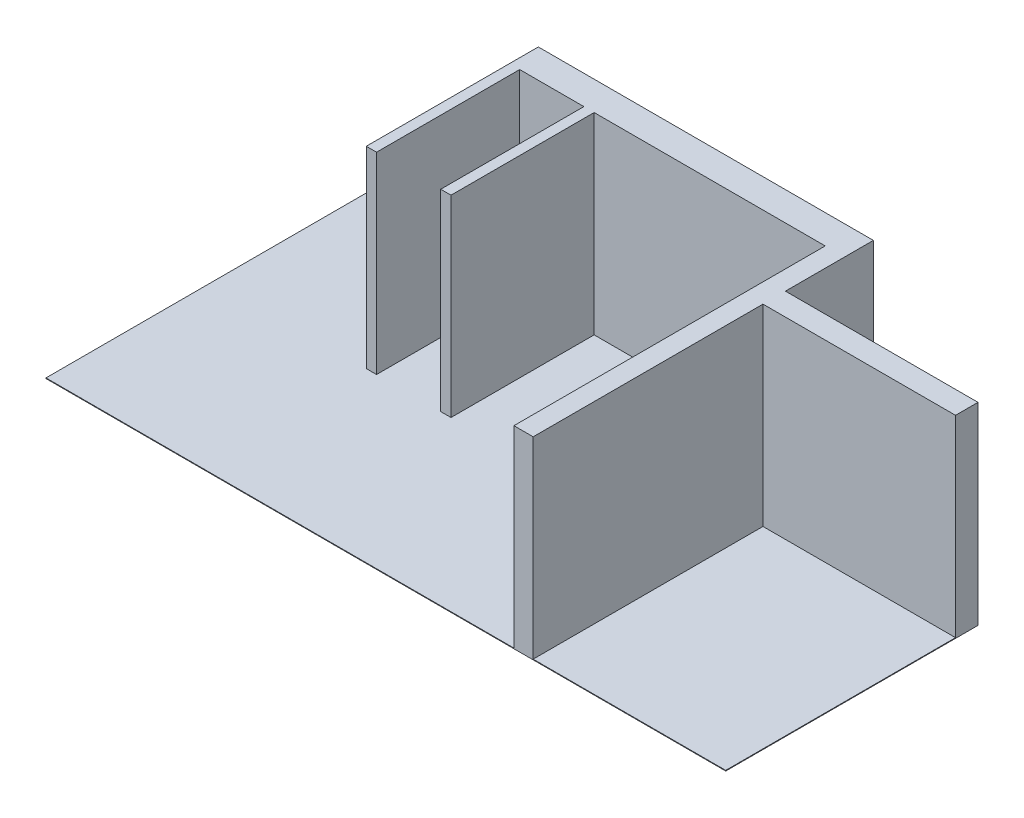
ISO-10303-21;
HEADER;
FILE_DESCRIPTION(('STEP AP214'),'2;1');
FILE_NAME('part.step','',(''),(''),'','','');
FILE_SCHEMA(('AUTOMOTIVE_DESIGN { 1 0 10303 214 1 1 1 1 }'));
ENDSEC;
DATA;
#1=APPLICATION_CONTEXT('core data for automotive mechanical design processes');
#2=APPLICATION_PROTOCOL_DEFINITION('international standard','automotive_design',2000,#1);
#3=PRODUCT_CONTEXT('',#1,'mechanical');
#4=PRODUCT('Part','Part','',(#3));
#5=PRODUCT_RELATED_PRODUCT_CATEGORY('part','',(#4));
#6=PRODUCT_DEFINITION_FORMATION('','',#4);
#7=PRODUCT_DEFINITION_CONTEXT('part definition',#1,'design');
#8=PRODUCT_DEFINITION('design','',#6,#7);
#9=PRODUCT_DEFINITION_SHAPE('','',#8);
#10=(LENGTH_UNIT() NAMED_UNIT(*) SI_UNIT(.MILLI.,.METRE.));
#11=(NAMED_UNIT(*) PLANE_ANGLE_UNIT() SI_UNIT($,.RADIAN.));
#12=(NAMED_UNIT(*) SI_UNIT($,.STERADIAN.) SOLID_ANGLE_UNIT());
#13=UNCERTAINTY_MEASURE_WITH_UNIT(LENGTH_MEASURE(1.E-05),#10,'distance_accuracy_value','');
#14=(GEOMETRIC_REPRESENTATION_CONTEXT(3) GLOBAL_UNCERTAINTY_ASSIGNED_CONTEXT((#13)) GLOBAL_UNIT_ASSIGNED_CONTEXT((#10,
#11,#12)) REPRESENTATION_CONTEXT('',''));
#15=CARTESIAN_POINT('',(0.,0.,0.));
#16=DIRECTION('',(0.,0.,1.));
#17=DIRECTION('',(1.,0.,0.));
#18=AXIS2_PLACEMENT_3D('',#15,#16,#17);
#19=CARTESIAN_POINT('',(-1800.,3000.,2230.));
#20=DIRECTION('',(-1.,0.,0.));
#21=DIRECTION('',(0.,0.,1.));
#22=AXIS2_PLACEMENT_3D('',#19,#20,#21);
#23=PLANE('',#22);
#24=DIRECTION('',(0.,0.,-1.));
#25=VECTOR('',#24,1.);
#26=CARTESIAN_POINT('',(-1800.,0.,2230.));
#27=LINE('',#26,#25);
#28=CARTESIAN_POINT('',(-1800.,0.,2230.));
#29=VERTEX_POINT('',#28);
#30=CARTESIAN_POINT('',(-1800.,0.,0.));
#31=VERTEX_POINT('',#30);
#32=EDGE_CURVE('E166',#29,#31,#27,.T.);
#33=ORIENTED_EDGE('',*,*,#32,.T.);
#34=DIRECTION('',(0.,-1.,0.));
#35=VECTOR('',#34,1.);
#36=CARTESIAN_POINT('',(-1800.,3000.,0.));
#37=LINE('',#36,#35);
#38=CARTESIAN_POINT('',(-1800.,3000.,0.));
#39=VERTEX_POINT('',#38);
#40=EDGE_CURVE('E11',#39,#31,#37,.T.);
#41=ORIENTED_EDGE('',*,*,#40,.F.);
#42=DIRECTION('',(0.,0.,-1.));
#43=VECTOR('',#42,1.);
#44=CARTESIAN_POINT('',(-1800.,3000.,2230.));
#45=LINE('',#44,#43);
#46=CARTESIAN_POINT('',(-1800.,3000.,2230.));
#47=VERTEX_POINT('',#46);
#48=EDGE_CURVE('E189',#47,#39,#45,.T.);
#49=ORIENTED_EDGE('',*,*,#48,.F.);
#50=DIRECTION('',(0.,-1.,0.));
#51=VECTOR('',#50,1.);
#52=CARTESIAN_POINT('',(-1800.,3000.,2230.));
#53=LINE('',#52,#51);
#54=EDGE_CURVE('E162',#47,#29,#53,.T.);
#55=ORIENTED_EDGE('',*,*,#54,.T.);
#56=EDGE_LOOP('',(#33,#41,#49,#55));
#57=FACE_BOUND('',#56,.T.);
#58=ADVANCED_FACE('F37',(#57),#23,.F.);
#59=CARTESIAN_POINT('',(-1800.,3000.,0.));
#60=DIRECTION('',(0.,0.,-1.));
#61=DIRECTION('',(-1.,0.,0.));
#62=AXIS2_PLACEMENT_3D('',#59,#60,#61);
#63=PLANE('',#62);
#64=DIRECTION('',(1.,0.,0.));
#65=VECTOR('',#64,1.);
#66=CARTESIAN_POINT('',(-1800.,0.,0.));
#67=LINE('',#66,#65);
#68=CARTESIAN_POINT('',(1800.,0.,-6.61309271539571E-13));
#69=VERTEX_POINT('',#68);
#70=EDGE_CURVE('E169',#31,#69,#67,.T.);
#71=ORIENTED_EDGE('',*,*,#70,.T.);
#72=DIRECTION('',(0.,-1.,0.));
#73=VECTOR('',#72,1.);
#74=CARTESIAN_POINT('',(1800.,3000.,-6.61309271539571E-13));
#75=LINE('',#74,#73);
#76=CARTESIAN_POINT('',(1800.,3000.,-6.61309271539571E-13));
#77=VERTEX_POINT('',#76);
#78=EDGE_CURVE('E45',#77,#69,#75,.T.);
#79=ORIENTED_EDGE('',*,*,#78,.F.);
#80=DIRECTION('',(1.,0.,0.));
#81=VECTOR('',#80,1.);
#82=CARTESIAN_POINT('',(-1800.,3000.,0.));
#83=LINE('',#82,#81);
#84=EDGE_CURVE('E102',#39,#77,#83,.T.);
#85=ORIENTED_EDGE('',*,*,#84,.F.);
#86=ORIENTED_EDGE('',*,*,#40,.T.);
#87=EDGE_LOOP('',(#71,#79,#85,#86));
#88=FACE_BOUND('',#87,.T.);
#89=ADVANCED_FACE('F306',(#88),#63,.F.);
#90=CARTESIAN_POINT('',(1800.,3000.,-6.61309271539571E-13));
#91=DIRECTION('',(1.,0.,0.));
#92=DIRECTION('',(0.,0.,-1.));
#93=AXIS2_PLACEMENT_3D('',#90,#91,#92);
#94=PLANE('',#93);
#95=DIRECTION('',(0.,0.,1.));
#96=VECTOR('',#95,1.);
#97=CARTESIAN_POINT('',(1800.,0.,-6.61309271539571E-13));
#98=LINE('',#97,#96);
#99=CARTESIAN_POINT('',(1800.,0.,4850.));
#100=VERTEX_POINT('',#99);
#101=EDGE_CURVE('E172',#69,#100,#98,.T.);
#102=ORIENTED_EDGE('',*,*,#101,.T.);
#103=DIRECTION('',(0.,-1.,0.));
#104=VECTOR('',#103,1.);
#105=CARTESIAN_POINT('',(1800.,3000.,4850.));
#106=LINE('',#105,#104);
#107=CARTESIAN_POINT('',(1800.,3000.,4850.));
#108=VERTEX_POINT('',#107);
#109=EDGE_CURVE('E219',#108,#100,#106,.T.);
#110=ORIENTED_EDGE('',*,*,#109,.F.);
#111=DIRECTION('',(0.,0.,1.));
#112=VECTOR('',#111,1.);
#113=CARTESIAN_POINT('',(1800.,3000.,-6.61309271539571E-13));
#114=LINE('',#113,#112);
#115=EDGE_CURVE('E227',#77,#108,#114,.T.);
#116=ORIENTED_EDGE('',*,*,#115,.F.);
#117=ORIENTED_EDGE('',*,*,#78,.T.);
#118=EDGE_LOOP('',(#102,#110,#116,#117));
#119=FACE_BOUND('',#118,.T.);
#120=ADVANCED_FACE('F225',(#119),#94,.F.);
#121=CARTESIAN_POINT('',(1800.,3000.,4850.));
#122=DIRECTION('',(0.,0.,-1.));
#123=DIRECTION('',(-1.,0.,0.));
#124=AXIS2_PLACEMENT_3D('',#121,#122,#123);
#125=PLANE('',#124);
#126=DIRECTION('',(-1.,0.,0.));
#127=VECTOR('',#126,1.);
#128=CARTESIAN_POINT('',(5100.,0.,4850.));
#129=LINE('',#128,#127);
#130=CARTESIAN_POINT('',(5100.,0.,4850.));
#131=VERTEX_POINT('',#130);
#132=CARTESIAN_POINT('',(2100.,0.,4850.));
#133=VERTEX_POINT('',#132);
#134=EDGE_CURVE('E473',#131,#133,#129,.T.);
#135=ORIENTED_EDGE('',*,*,#134,.T.);
#136=DIRECTION('',(0.,-1.,0.));
#137=VECTOR('',#136,1.);
#138=CARTESIAN_POINT('',(2100.,3000.,4850.));
#139=LINE('',#138,#137);
#140=CARTESIAN_POINT('',(2100.,3000.,4850.));
#141=VERTEX_POINT('',#140);
#142=EDGE_CURVE('E216',#141,#133,#139,.T.);
#143=ORIENTED_EDGE('',*,*,#142,.F.);
#144=DIRECTION('',(1.,0.,0.));
#145=VECTOR('',#144,1.);
#146=CARTESIAN_POINT('',(1800.,3000.,4850.));
#147=LINE('',#146,#145);
#148=EDGE_CURVE('E265',#108,#141,#147,.T.);
#149=ORIENTED_EDGE('',*,*,#148,.F.);
#150=ORIENTED_EDGE('',*,*,#109,.T.);
#151=DIRECTION('',(-1.,0.,0.));
#152=VECTOR('',#151,1.);
#153=CARTESIAN_POINT('',(1800.,0.,4850.));
#154=LINE('',#153,#152);
#155=CARTESIAN_POINT('',(-5489.74863964533,0.,4850.));
#156=VERTEX_POINT('',#155);
#157=EDGE_CURVE('E236',#100,#156,#154,.T.);
#158=ORIENTED_EDGE('',*,*,#157,.T.);
#159=DIRECTION('',(0.,1.,0.));
#160=VECTOR('',#159,1.);
#161=CARTESIAN_POINT('',(-5489.74863964533,-10.,4850.));
#162=LINE('',#161,#160);
#163=CARTESIAN_POINT('',(-5489.74863964533,-10.,4850.));
#164=VERTEX_POINT('',#163);
#165=EDGE_CURVE('E170',#164,#156,#162,.T.);
#166=ORIENTED_EDGE('',*,*,#165,.F.);
#167=DIRECTION('',(-1.,0.,0.));
#168=VECTOR('',#167,1.);
#169=CARTESIAN_POINT('',(1800.,-10.,4850.));
#170=LINE('',#169,#168);
#171=CARTESIAN_POINT('',(5100.,-10.,4850.));
#172=VERTEX_POINT('',#171);
#173=EDGE_CURVE('E488',#172,#164,#170,.T.);
#174=ORIENTED_EDGE('',*,*,#173,.F.);
#175=DIRECTION('',(0.,1.,0.));
#176=VECTOR('',#175,1.);
#177=CARTESIAN_POINT('',(5100.,-10.,4850.));
#178=LINE('',#177,#176);
#179=EDGE_CURVE('E244',#172,#131,#178,.T.);
#180=ORIENTED_EDGE('',*,*,#179,.T.);
#181=EDGE_LOOP('',(#135,#143,#149,#150,#158,#166,#174,#180));
#182=FACE_BOUND('',#181,.T.);
#183=ADVANCED_FACE('F313',(#182),#125,.F.);
#184=CARTESIAN_POINT('',(2100.,3000.,4850.));
#185=DIRECTION('',(-1.,0.,0.));
#186=DIRECTION('',(0.,0.,1.));
#187=AXIS2_PLACEMENT_3D('',#184,#185,#186);
#188=PLANE('',#187);
#189=DIRECTION('',(0.,0.,-1.));
#190=VECTOR('',#189,1.);
#191=CARTESIAN_POINT('',(2100.,0.,4850.));
#192=LINE('',#191,#190);
#193=CARTESIAN_POINT('',(2100.,0.,1270.));
#194=VERTEX_POINT('',#193);
#195=EDGE_CURVE('E174',#133,#194,#192,.T.);
#196=ORIENTED_EDGE('',*,*,#195,.T.);
#197=DIRECTION('',(0.,-1.,0.));
#198=VECTOR('',#197,1.);
#199=CARTESIAN_POINT('',(2100.,3000.,1270.));
#200=LINE('',#199,#198);
#201=CARTESIAN_POINT('',(2100.,3000.,1270.));
#202=VERTEX_POINT('',#201);
#203=EDGE_CURVE('E213',#202,#194,#200,.T.);
#204=ORIENTED_EDGE('',*,*,#203,.F.);
#205=DIRECTION('',(0.,0.,-1.));
#206=VECTOR('',#205,1.);
#207=CARTESIAN_POINT('',(2100.,3000.,4850.));
#208=LINE('',#207,#206);
#209=EDGE_CURVE('E267',#141,#202,#208,.T.);
#210=ORIENTED_EDGE('',*,*,#209,.F.);
#211=ORIENTED_EDGE('',*,*,#142,.T.);
#212=EDGE_LOOP('',(#196,#204,#210,#211));
#213=FACE_BOUND('',#212,.T.);
#214=ADVANCED_FACE('F318',(#213),#188,.F.);
#215=CARTESIAN_POINT('',(2100.,3000.,1270.));
#216=DIRECTION('',(0.,0.,-1.));
#217=DIRECTION('',(-1.,0.,0.));
#218=AXIS2_PLACEMENT_3D('',#215,#216,#217);
#219=PLANE('',#218);
#220=DIRECTION('',(1.,0.,0.));
#221=VECTOR('',#220,1.);
#222=CARTESIAN_POINT('',(2100.,0.,1270.));
#223=LINE('',#222,#221);
#224=CARTESIAN_POINT('',(5100.,0.,1270.));
#225=VERTEX_POINT('',#224);
#226=EDGE_CURVE('E177',#194,#225,#223,.T.);
#227=ORIENTED_EDGE('',*,*,#226,.T.);
#228=DIRECTION('',(0.,-1.,0.));
#229=VECTOR('',#228,1.);
#230=CARTESIAN_POINT('',(5100.,3000.,1270.));
#231=LINE('',#230,#229);
#232=CARTESIAN_POINT('',(5100.,3000.,1270.));
#233=VERTEX_POINT('',#232);
#234=EDGE_CURVE('E210',#233,#225,#231,.T.);
#235=ORIENTED_EDGE('',*,*,#234,.F.);
#236=DIRECTION('',(1.,0.,0.));
#237=VECTOR('',#236,1.);
#238=CARTESIAN_POINT('',(2100.,3000.,1270.));
#239=LINE('',#238,#237);
#240=EDGE_CURVE('E269',#202,#233,#239,.T.);
#241=ORIENTED_EDGE('',*,*,#240,.F.);
#242=ORIENTED_EDGE('',*,*,#203,.T.);
#243=EDGE_LOOP('',(#227,#235,#241,#242));
#244=FACE_BOUND('',#243,.T.);
#245=ADVANCED_FACE('F321',(#244),#219,.F.);
#246=CARTESIAN_POINT('',(5100.,3000.,1270.));
#247=DIRECTION('',(-1.,0.,0.));
#248=DIRECTION('',(0.,0.,1.));
#249=AXIS2_PLACEMENT_3D('',#246,#247,#248);
#250=PLANE('',#249);
#251=ORIENTED_EDGE('',*,*,#234,.T.);
#252=DIRECTION('',(0.,0.,1.));
#253=VECTOR('',#252,1.);
#254=CARTESIAN_POINT('',(5100.,0.,920.));
#255=LINE('',#254,#253);
#256=EDGE_CURVE('E463',#225,#131,#255,.T.);
#257=ORIENTED_EDGE('',*,*,#256,.T.);
#258=ORIENTED_EDGE('',*,*,#179,.F.);
#259=DIRECTION('',(0.,0.,1.));
#260=VECTOR('',#259,1.);
#261=CARTESIAN_POINT('',(5100.,-10.,920.));
#262=LINE('',#261,#260);
#263=CARTESIAN_POINT('',(5100.,-10.,920.));
#264=VERTEX_POINT('',#263);
#265=EDGE_CURVE('E249',#264,#172,#262,.T.);
#266=ORIENTED_EDGE('',*,*,#265,.F.);
#267=DIRECTION('',(0.,-1.,0.));
#268=VECTOR('',#267,1.);
#269=CARTESIAN_POINT('',(5100.,3000.,920.));
#270=LINE('',#269,#268);
#271=CARTESIAN_POINT('',(5100.,3000.,920.));
#272=VERTEX_POINT('',#271);
#273=EDGE_CURVE('E207',#272,#264,#270,.T.);
#274=ORIENTED_EDGE('',*,*,#273,.F.);
#275=DIRECTION('',(0.,0.,-1.));
#276=VECTOR('',#275,1.);
#277=CARTESIAN_POINT('',(5100.,3000.,1270.));
#278=LINE('',#277,#276);
#279=EDGE_CURVE('E271',#233,#272,#278,.T.);
#280=ORIENTED_EDGE('',*,*,#279,.F.);
#281=EDGE_LOOP('',(#251,#257,#258,#266,#274,#280));
#282=FACE_BOUND('',#281,.T.);
#283=ADVANCED_FACE('F325',(#282),#250,.F.);
#284=CARTESIAN_POINT('',(5100.,3000.,920.));
#285=DIRECTION('',(0.,0.,1.));
#286=DIRECTION('',(1.,0.,0.));
#287=AXIS2_PLACEMENT_3D('',#284,#285,#286);
#288=PLANE('',#287);
#289=ORIENTED_EDGE('',*,*,#273,.T.);
#290=DIRECTION('',(1.,0.,0.));
#291=VECTOR('',#290,1.);
#292=CARTESIAN_POINT('',(2100.,-10.,920.));
#293=LINE('',#292,#291);
#294=CARTESIAN_POINT('',(2100.,-10.,920.));
#295=VERTEX_POINT('',#294);
#296=EDGE_CURVE('E482',#295,#264,#293,.T.);
#297=ORIENTED_EDGE('',*,*,#296,.F.);
#298=DIRECTION('',(0.,-1.,0.));
#299=VECTOR('',#298,1.);
#300=CARTESIAN_POINT('',(2100.,3000.,920.));
#301=LINE('',#300,#299);
#302=CARTESIAN_POINT('',(2100.,3000.,920.));
#303=VERTEX_POINT('',#302);
#304=EDGE_CURVE('E204',#303,#295,#301,.T.);
#305=ORIENTED_EDGE('',*,*,#304,.F.);
#306=DIRECTION('',(-1.,0.,0.));
#307=VECTOR('',#306,1.);
#308=CARTESIAN_POINT('',(5100.,3000.,920.));
#309=LINE('',#308,#307);
#310=EDGE_CURVE('E273',#272,#303,#309,.T.);
#311=ORIENTED_EDGE('',*,*,#310,.F.);
#312=EDGE_LOOP('',(#289,#297,#305,#311));
#313=FACE_BOUND('',#312,.T.);
#314=ADVANCED_FACE('F329',(#313),#288,.F.);
#315=CARTESIAN_POINT('',(2100.,3000.,920.));
#316=DIRECTION('',(-1.,0.,0.));
#317=DIRECTION('',(0.,0.,1.));
#318=AXIS2_PLACEMENT_3D('',#315,#316,#317);
#319=PLANE('',#318);
#320=ORIENTED_EDGE('',*,*,#304,.T.);
#321=DIRECTION('',(0.,0.,1.));
#322=VECTOR('',#321,1.);
#323=CARTESIAN_POINT('',(2100.,-10.,-450.));
#324=LINE('',#323,#322);
#325=CARTESIAN_POINT('',(2100.,-10.,-450.));
#326=VERTEX_POINT('',#325);
#327=EDGE_CURVE('E479',#326,#295,#324,.T.);
#328=ORIENTED_EDGE('',*,*,#327,.F.);
#329=DIRECTION('',(0.,-1.,0.));
#330=VECTOR('',#329,1.);
#331=CARTESIAN_POINT('',(2100.,3000.,-450.));
#332=LINE('',#331,#330);
#333=CARTESIAN_POINT('',(2100.,3000.,-450.));
#334=VERTEX_POINT('',#333);
#335=EDGE_CURVE('E201',#334,#326,#332,.T.);
#336=ORIENTED_EDGE('',*,*,#335,.F.);
#337=DIRECTION('',(0.,0.,-1.));
#338=VECTOR('',#337,1.);
#339=CARTESIAN_POINT('',(2100.,3000.,920.));
#340=LINE('',#339,#338);
#341=EDGE_CURVE('E275',#303,#334,#340,.T.);
#342=ORIENTED_EDGE('',*,*,#341,.F.);
#343=EDGE_LOOP('',(#320,#328,#336,#342));
#344=FACE_BOUND('',#343,.T.);
#345=ADVANCED_FACE('F333',(#344),#319,.F.);
#346=CARTESIAN_POINT('',(2100.,3000.,-450.));
#347=DIRECTION('',(0.,0.,1.));
#348=DIRECTION('',(1.,0.,0.));
#349=AXIS2_PLACEMENT_3D('',#346,#347,#348);
#350=PLANE('',#349);
#351=ORIENTED_EDGE('',*,*,#335,.T.);
#352=DIRECTION('',(1.,0.,0.));
#353=VECTOR('',#352,1.);
#354=CARTESIAN_POINT('',(1800.,-10.,-450.));
#355=LINE('',#354,#353);
#356=CARTESIAN_POINT('',(-5489.74863964533,-10.,-449.999999999999));
#357=VERTEX_POINT('',#356);
#358=EDGE_CURVE('E257',#357,#326,#355,.T.);
#359=ORIENTED_EDGE('',*,*,#358,.F.);
#360=DIRECTION('',(0.,1.,0.));
#361=VECTOR('',#360,1.);
#362=CARTESIAN_POINT('',(-5489.74863964533,-10.,-449.999999999999));
#363=LINE('',#362,#361);
#364=CARTESIAN_POINT('',(-5489.74863964533,0.,-449.999999999999));
#365=VERTEX_POINT('',#364);
#366=EDGE_CURVE('E258',#357,#365,#363,.T.);
#367=ORIENTED_EDGE('',*,*,#366,.T.);
#368=DIRECTION('',(1.,0.,0.));
#369=VECTOR('',#368,1.);
#370=CARTESIAN_POINT('',(-3120.,0.,-449.999999999999));
#371=LINE('',#370,#369);
#372=CARTESIAN_POINT('',(-3120.,0.,-449.999999999999));
#373=VERTEX_POINT('',#372);
#374=EDGE_CURVE('E246',#365,#373,#371,.T.);
#375=ORIENTED_EDGE('',*,*,#374,.T.);
#376=DIRECTION('',(0.,-1.,0.));
#377=VECTOR('',#376,1.);
#378=CARTESIAN_POINT('',(-3120.,3000.,-449.999999999999));
#379=LINE('',#378,#377);
#380=CARTESIAN_POINT('',(-3120.,3000.,-449.999999999999));
#381=VERTEX_POINT('',#380);
#382=EDGE_CURVE('E199',#381,#373,#379,.T.);
#383=ORIENTED_EDGE('',*,*,#382,.F.);
#384=DIRECTION('',(-1.,0.,0.));
#385=VECTOR('',#384,1.);
#386=CARTESIAN_POINT('',(2100.,3000.,-450.));
#387=LINE('',#386,#385);
#388=EDGE_CURVE('E277',#334,#381,#387,.T.);
#389=ORIENTED_EDGE('',*,*,#388,.F.);
#390=EDGE_LOOP('',(#351,#359,#367,#375,#383,#389));
#391=FACE_BOUND('',#390,.T.);
#392=ADVANCED_FACE('F337',(#391),#350,.F.);
#393=CARTESIAN_POINT('',(-3120.,3000.,2230.));
#394=DIRECTION('',(1.,0.,0.));
#395=DIRECTION('',(0.,0.,-1.));
#396=AXIS2_PLACEMENT_3D('',#393,#394,#395);
#397=PLANE('',#396);
#398=DIRECTION('',(0.,0.,1.));
#399=VECTOR('',#398,1.);
#400=CARTESIAN_POINT('',(-3120.,0.,2230.));
#401=LINE('',#400,#399);
#402=CARTESIAN_POINT('',(-3120.,0.,2230.));
#403=VERTEX_POINT('',#402);
#404=EDGE_CURVE('E180',#373,#403,#401,.T.);
#405=ORIENTED_EDGE('',*,*,#404,.T.);
#406=DIRECTION('',(0.,-1.,0.));
#407=VECTOR('',#406,1.);
#408=CARTESIAN_POINT('',(-3120.,3000.,2230.));
#409=LINE('',#408,#407);
#410=CARTESIAN_POINT('',(-3120.,3000.,2230.));
#411=VERTEX_POINT('',#410);
#412=EDGE_CURVE('E196',#411,#403,#409,.T.);
#413=ORIENTED_EDGE('',*,*,#412,.F.);
#414=DIRECTION('',(0.,0.,1.));
#415=VECTOR('',#414,1.);
#416=CARTESIAN_POINT('',(-3120.,3000.,2230.));
#417=LINE('',#416,#415);
#418=EDGE_CURVE('E279',#381,#411,#417,.T.);
#419=ORIENTED_EDGE('',*,*,#418,.F.);
#420=ORIENTED_EDGE('',*,*,#382,.T.);
#421=EDGE_LOOP('',(#405,#413,#419,#420));
#422=FACE_BOUND('',#421,.T.);
#423=ADVANCED_FACE('F341',(#422),#397,.F.);
#424=CARTESIAN_POINT('',(-2960.,3000.,2230.));
#425=DIRECTION('',(0.,0.,-1.));
#426=DIRECTION('',(-1.,0.,0.));
#427=AXIS2_PLACEMENT_3D('',#424,#425,#426);
#428=PLANE('',#427);
#429=DIRECTION('',(1.,0.,0.));
#430=VECTOR('',#429,1.);
#431=CARTESIAN_POINT('',(-2960.,0.,2230.));
#432=LINE('',#431,#430);
#433=CARTESIAN_POINT('',(-2960.,0.,2230.));
#434=VERTEX_POINT('',#433);
#435=EDGE_CURVE('E182',#403,#434,#432,.T.);
#436=ORIENTED_EDGE('',*,*,#435,.T.);
#437=DIRECTION('',(0.,-1.,0.));
#438=VECTOR('',#437,1.);
#439=CARTESIAN_POINT('',(-2960.,3000.,2230.));
#440=LINE('',#439,#438);
#441=CARTESIAN_POINT('',(-2960.,3000.,2230.));
#442=VERTEX_POINT('',#441);
#443=EDGE_CURVE('E193',#442,#434,#440,.T.);
#444=ORIENTED_EDGE('',*,*,#443,.F.);
#445=DIRECTION('',(1.,0.,0.));
#446=VECTOR('',#445,1.);
#447=CARTESIAN_POINT('',(-2960.,3000.,2230.));
#448=LINE('',#447,#446);
#449=EDGE_CURVE('E281',#411,#442,#448,.T.);
#450=ORIENTED_EDGE('',*,*,#449,.F.);
#451=ORIENTED_EDGE('',*,*,#412,.T.);
#452=EDGE_LOOP('',(#436,#444,#450,#451));
#453=FACE_BOUND('',#452,.T.);
#454=ADVANCED_FACE('F287',(#453),#428,.F.);
#455=CARTESIAN_POINT('',(-2960.,3000.,0.));
#456=DIRECTION('',(-1.,0.,0.));
#457=DIRECTION('',(0.,0.,1.));
#458=AXIS2_PLACEMENT_3D('',#455,#456,#457);
#459=PLANE('',#458);
#460=DIRECTION('',(0.,0.,-1.));
#461=VECTOR('',#460,1.);
#462=CARTESIAN_POINT('',(-2960.,0.,0.));
#463=LINE('',#462,#461);
#464=CARTESIAN_POINT('',(-2960.,0.,0.));
#465=VERTEX_POINT('',#464);
#466=EDGE_CURVE('E184',#434,#465,#463,.T.);
#467=ORIENTED_EDGE('',*,*,#466,.T.);
#468=DIRECTION('',(0.,-1.,0.));
#469=VECTOR('',#468,1.);
#470=CARTESIAN_POINT('',(-2960.,3000.,0.));
#471=LINE('',#470,#469);
#472=CARTESIAN_POINT('',(-2960.,3000.,0.));
#473=VERTEX_POINT('',#472);
#474=EDGE_CURVE('E157',#473,#465,#471,.T.);
#475=ORIENTED_EDGE('',*,*,#474,.F.);
#476=DIRECTION('',(0.,0.,-1.));
#477=VECTOR('',#476,1.);
#478=CARTESIAN_POINT('',(-2960.,3000.,0.));
#479=LINE('',#478,#477);
#480=EDGE_CURVE('E148',#442,#473,#479,.T.);
#481=ORIENTED_EDGE('',*,*,#480,.F.);
#482=ORIENTED_EDGE('',*,*,#443,.T.);
#483=EDGE_LOOP('',(#467,#475,#481,#482));
#484=FACE_BOUND('',#483,.T.);
#485=ADVANCED_FACE('F291',(#484),#459,.F.);
#486=CARTESIAN_POINT('',(-2960.,3000.,0.));
#487=DIRECTION('',(0.,0.,-1.));
#488=DIRECTION('',(-1.,0.,0.));
#489=AXIS2_PLACEMENT_3D('',#486,#487,#488);
#490=PLANE('',#489);
#491=DIRECTION('',(1.,0.,0.));
#492=VECTOR('',#491,1.);
#493=CARTESIAN_POINT('',(-2960.,0.,0.));
#494=LINE('',#493,#492);
#495=CARTESIAN_POINT('',(-1960.,0.,0.));
#496=VERTEX_POINT('',#495);
#497=EDGE_CURVE('E156',#465,#496,#494,.T.);
#498=ORIENTED_EDGE('',*,*,#497,.T.);
#499=DIRECTION('',(0.,-1.,0.));
#500=VECTOR('',#499,1.);
#501=CARTESIAN_POINT('',(-1960.,3000.,0.));
#502=LINE('',#501,#500);
#503=CARTESIAN_POINT('',(-1960.,3000.,0.));
#504=VERTEX_POINT('',#503);
#505=EDGE_CURVE('E153',#504,#496,#502,.T.);
#506=ORIENTED_EDGE('',*,*,#505,.F.);
#507=DIRECTION('',(1.,0.,0.));
#508=VECTOR('',#507,1.);
#509=CARTESIAN_POINT('',(-2960.,3000.,0.));
#510=LINE('',#509,#508);
#511=EDGE_CURVE('E142',#473,#504,#510,.T.);
#512=ORIENTED_EDGE('',*,*,#511,.F.);
#513=ORIENTED_EDGE('',*,*,#474,.T.);
#514=EDGE_LOOP('',(#498,#506,#512,#513));
#515=FACE_BOUND('',#514,.T.);
#516=ADVANCED_FACE('F154',(#515),#490,.F.);
#517=CARTESIAN_POINT('',(-1960.,3000.,0.));
#518=DIRECTION('',(1.,0.,0.));
#519=DIRECTION('',(0.,0.,-1.));
#520=AXIS2_PLACEMENT_3D('',#517,#518,#519);
#521=PLANE('',#520);
#522=DIRECTION('',(0.,0.,1.));
#523=VECTOR('',#522,1.);
#524=CARTESIAN_POINT('',(-1960.,0.,0.));
#525=LINE('',#524,#523);
#526=CARTESIAN_POINT('',(-1960.,0.,2230.));
#527=VERTEX_POINT('',#526);
#528=EDGE_CURVE('E88',#496,#527,#525,.T.);
#529=ORIENTED_EDGE('',*,*,#528,.T.);
#530=DIRECTION('',(0.,-1.,0.));
#531=VECTOR('',#530,1.);
#532=CARTESIAN_POINT('',(-1960.,3000.,2230.));
#533=LINE('',#532,#531);
#534=CARTESIAN_POINT('',(-1960.,3000.,2230.));
#535=VERTEX_POINT('',#534);
#536=EDGE_CURVE('E158',#535,#527,#533,.T.);
#537=ORIENTED_EDGE('',*,*,#536,.F.);
#538=DIRECTION('',(0.,0.,1.));
#539=VECTOR('',#538,1.);
#540=CARTESIAN_POINT('',(-1960.,3000.,0.));
#541=LINE('',#540,#539);
#542=EDGE_CURVE('E146',#504,#535,#541,.T.);
#543=ORIENTED_EDGE('',*,*,#542,.F.);
#544=ORIENTED_EDGE('',*,*,#505,.T.);
#545=EDGE_LOOP('',(#529,#537,#543,#544));
#546=FACE_BOUND('',#545,.T.);
#547=ADVANCED_FACE('F160',(#546),#521,.F.);
#548=CARTESIAN_POINT('',(-1960.,3000.,2230.));
#549=DIRECTION('',(0.,0.,-1.));
#550=DIRECTION('',(-1.,0.,0.));
#551=AXIS2_PLACEMENT_3D('',#548,#549,#550);
#552=PLANE('',#551);
#553=DIRECTION('',(1.,0.,0.));
#554=VECTOR('',#553,1.);
#555=CARTESIAN_POINT('',(-1960.,0.,2230.));
#556=LINE('',#555,#554);
#557=EDGE_CURVE('E94',#527,#29,#556,.T.);
#558=ORIENTED_EDGE('',*,*,#557,.T.);
#559=ORIENTED_EDGE('',*,*,#54,.F.);
#560=DIRECTION('',(1.,0.,0.));
#561=VECTOR('',#560,1.);
#562=CARTESIAN_POINT('',(-1960.,3000.,2230.));
#563=LINE('',#562,#561);
#564=EDGE_CURVE('E53',#535,#47,#563,.T.);
#565=ORIENTED_EDGE('',*,*,#564,.F.);
#566=ORIENTED_EDGE('',*,*,#536,.T.);
#567=EDGE_LOOP('',(#558,#559,#565,#566));
#568=FACE_BOUND('',#567,.T.);
#569=ADVANCED_FACE('F295',(#568),#552,.F.);
#570=CARTESIAN_POINT('',(0.,3000.,0.));
#571=DIRECTION('',(0.,-1.,0.));
#572=DIRECTION('',(0.,0.,-1.));
#573=AXIS2_PLACEMENT_3D('',#570,#571,#572);
#574=PLANE('',#573);
#575=ORIENTED_EDGE('',*,*,#48,.T.);
#576=ORIENTED_EDGE('',*,*,#84,.T.);
#577=ORIENTED_EDGE('',*,*,#115,.T.);
#578=ORIENTED_EDGE('',*,*,#148,.T.);
#579=ORIENTED_EDGE('',*,*,#209,.T.);
#580=ORIENTED_EDGE('',*,*,#240,.T.);
#581=ORIENTED_EDGE('',*,*,#279,.T.);
#582=ORIENTED_EDGE('',*,*,#310,.T.);
#583=ORIENTED_EDGE('',*,*,#341,.T.);
#584=ORIENTED_EDGE('',*,*,#388,.T.);
#585=ORIENTED_EDGE('',*,*,#418,.T.);
#586=ORIENTED_EDGE('',*,*,#449,.T.);
#587=ORIENTED_EDGE('',*,*,#480,.T.);
#588=ORIENTED_EDGE('',*,*,#511,.T.);
#589=ORIENTED_EDGE('',*,*,#542,.T.);
#590=ORIENTED_EDGE('',*,*,#564,.T.);
#591=EDGE_LOOP('',(#575,#576,#577,#578,#579,#580,#581,#582,#583,#584,#585,#586,#587,#588,#589,#590));
#592=FACE_BOUND('',#591,.T.);
#593=ADVANCED_FACE('F144',(#592),#574,.F.);
#594=CARTESIAN_POINT('',(-5489.74863964533,-10.,4850.));
#595=DIRECTION('',(1.,0.,0.));
#596=DIRECTION('',(0.,0.,-1.));
#597=AXIS2_PLACEMENT_3D('',#594,#595,#596);
#598=PLANE('',#597);
#599=DIRECTION('',(0.,0.,-1.));
#600=VECTOR('',#599,1.);
#601=CARTESIAN_POINT('',(-5489.74863964533,0.,4850.));
#602=LINE('',#601,#600);
#603=EDGE_CURVE('E240',#156,#365,#602,.T.);
#604=ORIENTED_EDGE('',*,*,#603,.T.);
#605=ORIENTED_EDGE('',*,*,#366,.F.);
#606=DIRECTION('',(0.,0.,-1.));
#607=VECTOR('',#606,1.);
#608=CARTESIAN_POINT('',(-5489.74863964533,-10.,4850.));
#609=LINE('',#608,#607);
#610=EDGE_CURVE('E252',#164,#357,#609,.T.);
#611=ORIENTED_EDGE('',*,*,#610,.F.);
#612=ORIENTED_EDGE('',*,*,#165,.T.);
#613=EDGE_LOOP('',(#604,#605,#611,#612));
#614=FACE_BOUND('',#613,.T.);
#615=ADVANCED_FACE('F302',(#614),#598,.F.);
#616=CARTESIAN_POINT('',(0.,-10.,0.));
#617=DIRECTION('',(0.,-1.,0.));
#618=DIRECTION('',(0.,0.,-1.));
#619=AXIS2_PLACEMENT_3D('',#616,#617,#618);
#620=PLANE('',#619);
#621=ORIENTED_EDGE('',*,*,#358,.T.);
#622=ORIENTED_EDGE('',*,*,#327,.T.);
#623=ORIENTED_EDGE('',*,*,#296,.T.);
#624=ORIENTED_EDGE('',*,*,#265,.T.);
#625=ORIENTED_EDGE('',*,*,#173,.T.);
#626=ORIENTED_EDGE('',*,*,#610,.T.);
#627=EDGE_LOOP('',(#621,#622,#623,#624,#625,#626));
#628=FACE_BOUND('',#627,.T.);
#629=ADVANCED_FACE('F373',(#628),#620,.T.);
#630=CARTESIAN_POINT('',(0.,0.,0.));
#631=DIRECTION('',(0.,-1.,0.));
#632=DIRECTION('',(0.,0.,-1.));
#633=AXIS2_PLACEMENT_3D('',#630,#631,#632);
#634=PLANE('',#633);
#635=ORIENTED_EDGE('',*,*,#404,.F.);
#636=ORIENTED_EDGE('',*,*,#374,.F.);
#637=ORIENTED_EDGE('',*,*,#603,.F.);
#638=ORIENTED_EDGE('',*,*,#157,.F.);
#639=ORIENTED_EDGE('',*,*,#101,.F.);
#640=ORIENTED_EDGE('',*,*,#70,.F.);
#641=ORIENTED_EDGE('',*,*,#32,.F.);
#642=ORIENTED_EDGE('',*,*,#557,.F.);
#643=ORIENTED_EDGE('',*,*,#528,.F.);
#644=ORIENTED_EDGE('',*,*,#497,.F.);
#645=ORIENTED_EDGE('',*,*,#466,.F.);
#646=ORIENTED_EDGE('',*,*,#435,.F.);
#647=EDGE_LOOP('',(#635,#636,#637,#638,#639,#640,#641,#642,#643,#644,#645,#646));
#648=FACE_BOUND('',#647,.T.);
#649=ADVANCED_FACE('F232',(#648),#634,.F.);
#650=CARTESIAN_POINT('',(0.,0.,0.));
#651=DIRECTION('',(0.,-1.,0.));
#652=DIRECTION('',(0.,0.,-1.));
#653=AXIS2_PLACEMENT_3D('',#650,#651,#652);
#654=PLANE('',#653);
#655=ORIENTED_EDGE('',*,*,#226,.F.);
#656=ORIENTED_EDGE('',*,*,#195,.F.);
#657=ORIENTED_EDGE('',*,*,#134,.F.);
#658=ORIENTED_EDGE('',*,*,#256,.F.);
#659=EDGE_LOOP('',(#655,#656,#657,#658));
#660=FACE_BOUND('',#659,.T.);
#661=ADVANCED_FACE('F386',(#660),#654,.F.);
#662=CLOSED_SHELL('',(#58,#89,#120,#183,#214,#245,#283,#314,#345,#392,#423,#454,#485,#516,#547,
#569,#593,#615,#629,#649,#661));
#663=MANIFOLD_SOLID_BREP('B2',#662);
#664=ADVANCED_BREP_SHAPE_REPRESENTATION('',(#18,#663),#14);
#665=SHAPE_DEFINITION_REPRESENTATION(#9,#664);
ENDSEC;
END-ISO-10303-21;
